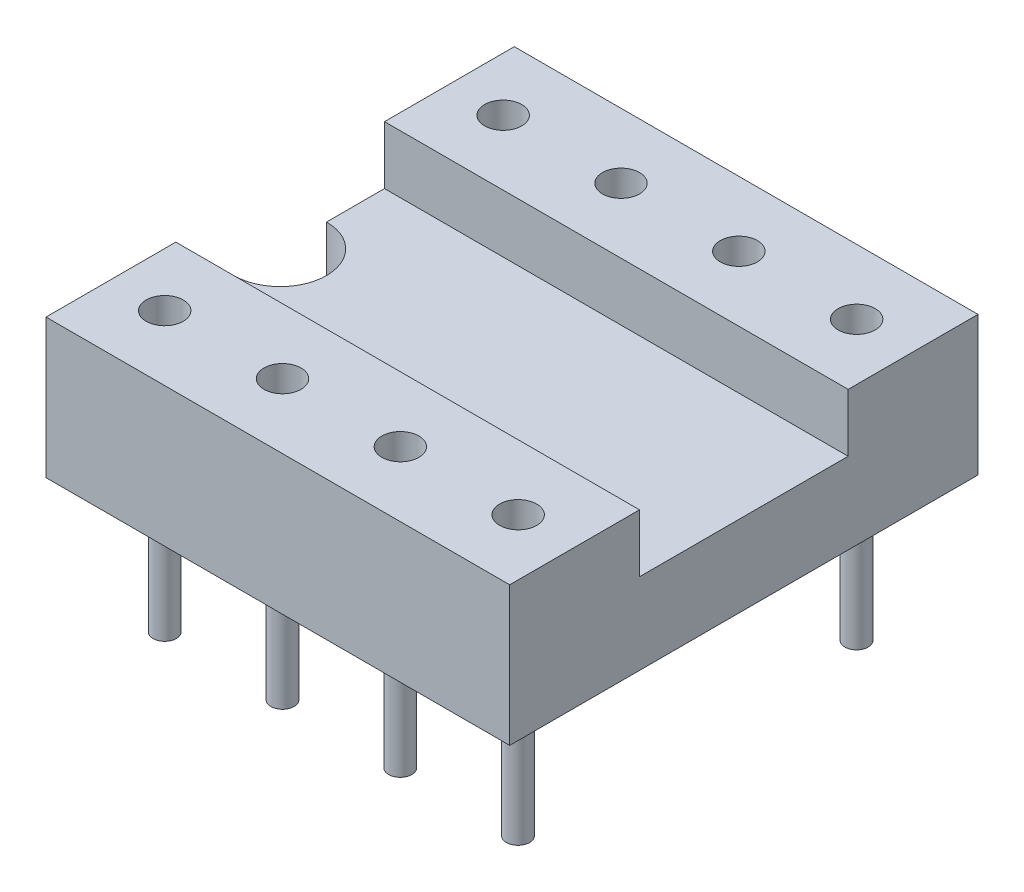
ISO-10303-21;
HEADER;
FILE_DESCRIPTION(('STEP AP214'),'2;1');
FILE_NAME('part.step','',(''),(''),'','','');
FILE_SCHEMA(('AUTOMOTIVE_DESIGN { 1 0 10303 214 1 1 1 1 }'));
ENDSEC;
DATA;
#1=APPLICATION_CONTEXT('core data for automotive mechanical design processes');
#2=APPLICATION_PROTOCOL_DEFINITION('international standard','automotive_design',2000,#1);
#3=PRODUCT_CONTEXT('',#1,'mechanical');
#4=PRODUCT('Part','Part','',(#3));
#5=PRODUCT_RELATED_PRODUCT_CATEGORY('part','',(#4));
#6=PRODUCT_DEFINITION_FORMATION('','',#4);
#7=PRODUCT_DEFINITION_CONTEXT('part definition',#1,'design');
#8=PRODUCT_DEFINITION('design','',#6,#7);
#9=PRODUCT_DEFINITION_SHAPE('','',#8);
#10=(LENGTH_UNIT() NAMED_UNIT(*) SI_UNIT(.MILLI.,.METRE.));
#11=(NAMED_UNIT(*) PLANE_ANGLE_UNIT() SI_UNIT($,.RADIAN.));
#12=(NAMED_UNIT(*) SI_UNIT($,.STERADIAN.) SOLID_ANGLE_UNIT());
#13=UNCERTAINTY_MEASURE_WITH_UNIT(LENGTH_MEASURE(1.E-05),#10,'distance_accuracy_value','');
#14=(GEOMETRIC_REPRESENTATION_CONTEXT(3) GLOBAL_UNCERTAINTY_ASSIGNED_CONTEXT((#13)) GLOBAL_UNIT_ASSIGNED_CONTEXT((#10,
#11,#12)) REPRESENTATION_CONTEXT('',''));
#15=CARTESIAN_POINT('',(0.,0.,0.));
#16=DIRECTION('',(0.,0.,1.));
#17=DIRECTION('',(1.,0.,0.));
#18=AXIS2_PLACEMENT_3D('',#15,#16,#17);
#19=CARTESIAN_POINT('',(10.,0.,5.05));
#20=DIRECTION('',(0.,1.,0.));
#21=DIRECTION('',(0.,0.,1.));
#22=AXIS2_PLACEMENT_3D('',#19,#20,#21);
#23=PLANE('',#22);
#24=CARTESIAN_POINT('',(8.78,0.,3.65));
#25=DIRECTION('',(0.,1.,0.));
#26=DIRECTION('',(0.,0.,1.));
#27=AXIS2_PLACEMENT_3D('',#24,#25,#26);
#28=CIRCLE('',#27,0.25);
#29=CARTESIAN_POINT('',(8.78,0.,3.9));
#30=VERTEX_POINT('',#29);
#31=EDGE_CURVE('E44',#30,#30,#28,.F.);
#32=ORIENTED_EDGE('',*,*,#31,.F.);
#33=EDGE_LOOP('',(#32));
#34=FACE_BOUND('',#33,.T.);
#35=CARTESIAN_POINT('',(6.24,0.,3.65));
#36=DIRECTION('',(0.,1.,0.));
#37=DIRECTION('',(0.,0.,1.));
#38=AXIS2_PLACEMENT_3D('',#35,#36,#37);
#39=CIRCLE('',#38,0.25);
#40=CARTESIAN_POINT('',(6.24,0.,3.9));
#41=VERTEX_POINT('',#40);
#42=EDGE_CURVE('E202',#41,#41,#39,.F.);
#43=ORIENTED_EDGE('',*,*,#42,.F.);
#44=EDGE_LOOP('',(#43));
#45=FACE_BOUND('',#44,.T.);
#46=CARTESIAN_POINT('',(3.7,0.,3.65));
#47=DIRECTION('',(0.,1.,0.));
#48=DIRECTION('',(0.,0.,1.));
#49=AXIS2_PLACEMENT_3D('',#46,#47,#48);
#50=CIRCLE('',#49,0.25);
#51=CARTESIAN_POINT('',(3.7,0.,3.9));
#52=VERTEX_POINT('',#51);
#53=EDGE_CURVE('E196',#52,#52,#50,.F.);
#54=ORIENTED_EDGE('',*,*,#53,.F.);
#55=EDGE_LOOP('',(#54));
#56=FACE_BOUND('',#55,.T.);
#57=CARTESIAN_POINT('',(1.16,0.,3.65));
#58=DIRECTION('',(0.,1.,0.));
#59=DIRECTION('',(0.,0.,1.));
#60=AXIS2_PLACEMENT_3D('',#57,#58,#59);
#61=CIRCLE('',#60,0.25);
#62=CARTESIAN_POINT('',(1.16,0.,3.9));
#63=VERTEX_POINT('',#62);
#64=EDGE_CURVE('E190',#63,#63,#61,.F.);
#65=ORIENTED_EDGE('',*,*,#64,.F.);
#66=EDGE_LOOP('',(#65));
#67=FACE_BOUND('',#66,.T.);
#68=DIRECTION('',(0.,0.,-1.));
#69=VECTOR('',#68,1.);
#70=CARTESIAN_POINT('',(0.,0.,5.05));
#71=LINE('',#70,#69);
#72=CARTESIAN_POINT('',(0.,0.,5.05));
#73=VERTEX_POINT('',#72);
#74=CARTESIAN_POINT('',(0.,0.,1.));
#75=VERTEX_POINT('',#74);
#76=EDGE_CURVE('E144',#73,#75,#71,.T.);
#77=ORIENTED_EDGE('',*,*,#76,.T.);
#78=CARTESIAN_POINT('',(0.,0.,0.));
#79=DIRECTION('',(0.,1.,0.));
#80=DIRECTION('',(0.,0.,1.));
#81=AXIS2_PLACEMENT_3D('',#78,#79,#80);
#82=CIRCLE('',#81,1.);
#83=CARTESIAN_POINT('',(0.,0.,-1.));
#84=VERTEX_POINT('',#83);
#85=EDGE_CURVE('E51',#75,#84,#82,.T.);
#86=ORIENTED_EDGE('',*,*,#85,.T.);
#87=CARTESIAN_POINT('',(0.,0.,-5.05));
#88=VERTEX_POINT('',#87);
#89=EDGE_CURVE('E129',#84,#88,#71,.T.);
#90=ORIENTED_EDGE('',*,*,#89,.T.);
#91=DIRECTION('',(-1.,0.,0.));
#92=VECTOR('',#91,1.);
#93=CARTESIAN_POINT('',(10.,0.,-5.05));
#94=LINE('',#93,#92);
#95=CARTESIAN_POINT('',(10.,0.,-5.05));
#96=VERTEX_POINT('',#95);
#97=EDGE_CURVE('E175',#96,#88,#94,.T.);
#98=ORIENTED_EDGE('',*,*,#97,.F.);
#99=DIRECTION('',(0.,0.,-1.));
#100=VECTOR('',#99,1.);
#101=CARTESIAN_POINT('',(10.,0.,5.05));
#102=LINE('',#101,#100);
#103=CARTESIAN_POINT('',(10.,0.,5.05));
#104=VERTEX_POINT('',#103);
#105=EDGE_CURVE('E161',#104,#96,#102,.T.);
#106=ORIENTED_EDGE('',*,*,#105,.F.);
#107=DIRECTION('',(-1.,0.,0.));
#108=VECTOR('',#107,1.);
#109=CARTESIAN_POINT('',(10.,0.,5.05));
#110=LINE('',#109,#108);
#111=EDGE_CURVE('E178',#104,#73,#110,.T.);
#112=ORIENTED_EDGE('',*,*,#111,.T.);
#113=EDGE_LOOP('',(#77,#86,#90,#98,#106,#112));
#114=FACE_BOUND('',#113,.T.);
#115=CARTESIAN_POINT('',(1.16,0.,-3.65));
#116=DIRECTION('',(0.,1.,0.));
#117=DIRECTION('',(0.,0.,1.));
#118=AXIS2_PLACEMENT_3D('',#115,#116,#117);
#119=CIRCLE('',#118,0.25);
#120=CARTESIAN_POINT('',(1.16,0.,-3.4));
#121=VERTEX_POINT('',#120);
#122=EDGE_CURVE('E193',#121,#121,#119,.F.);
#123=ORIENTED_EDGE('',*,*,#122,.F.);
#124=EDGE_LOOP('',(#123));
#125=FACE_BOUND('',#124,.T.);
#126=CARTESIAN_POINT('',(3.7,0.,-3.65));
#127=DIRECTION('',(0.,1.,0.));
#128=DIRECTION('',(0.,0.,1.));
#129=AXIS2_PLACEMENT_3D('',#126,#127,#128);
#130=CIRCLE('',#129,0.25);
#131=CARTESIAN_POINT('',(3.7,0.,-3.4));
#132=VERTEX_POINT('',#131);
#133=EDGE_CURVE('E199',#132,#132,#130,.F.);
#134=ORIENTED_EDGE('',*,*,#133,.F.);
#135=EDGE_LOOP('',(#134));
#136=FACE_BOUND('',#135,.T.);
#137=CARTESIAN_POINT('',(6.24,0.,-3.65));
#138=DIRECTION('',(0.,1.,0.));
#139=DIRECTION('',(0.,0.,1.));
#140=AXIS2_PLACEMENT_3D('',#137,#138,#139);
#141=CIRCLE('',#140,0.25);
#142=CARTESIAN_POINT('',(6.24,0.,-3.4));
#143=VERTEX_POINT('',#142);
#144=EDGE_CURVE('E205',#143,#143,#141,.F.);
#145=ORIENTED_EDGE('',*,*,#144,.F.);
#146=EDGE_LOOP('',(#145));
#147=FACE_BOUND('',#146,.T.);
#148=CARTESIAN_POINT('',(8.78,0.,-3.65));
#149=DIRECTION('',(0.,1.,0.));
#150=DIRECTION('',(0.,0.,1.));
#151=AXIS2_PLACEMENT_3D('',#148,#149,#150);
#152=CIRCLE('',#151,0.25);
#153=CARTESIAN_POINT('',(8.78,0.,-3.4));
#154=VERTEX_POINT('',#153);
#155=EDGE_CURVE('E11',#154,#154,#152,.F.);
#156=ORIENTED_EDGE('',*,*,#155,.F.);
#157=EDGE_LOOP('',(#156));
#158=FACE_BOUND('',#157,.T.);
#159=ADVANCED_FACE('F36',(#34,#45,#56,#67,#114,#125,#136,#147,#158),#23,.F.);
#160=CARTESIAN_POINT('',(0.,1.75,5.05));
#161=DIRECTION('',(1.,0.,0.));
#162=DIRECTION('',(0.,0.,-1.));
#163=AXIS2_PLACEMENT_3D('',#160,#161,#162);
#164=PLANE('',#163);
#165=ORIENTED_EDGE('',*,*,#89,.F.);
#166=DIRECTION('',(0.,1.,0.));
#167=VECTOR('',#166,1.);
#168=CARTESIAN_POINT('',(0.,0.,-1.));
#169=LINE('',#168,#167);
#170=CARTESIAN_POINT('',(0.,1.75,-1.));
#171=VERTEX_POINT('',#170);
#172=EDGE_CURVE('E115',#84,#171,#169,.T.);
#173=ORIENTED_EDGE('',*,*,#172,.T.);
#174=DIRECTION('',(0.,0.,1.));
#175=VECTOR('',#174,1.);
#176=CARTESIAN_POINT('',(0.,1.75,-2.25));
#177=LINE('',#176,#175);
#178=CARTESIAN_POINT('',(0.,1.75,-2.25));
#179=VERTEX_POINT('',#178);
#180=EDGE_CURVE('E127',#179,#171,#177,.T.);
#181=ORIENTED_EDGE('',*,*,#180,.F.);
#182=DIRECTION('',(0.,-1.,0.));
#183=VECTOR('',#182,1.);
#184=CARTESIAN_POINT('',(0.,3.,-2.25));
#185=LINE('',#184,#183);
#186=CARTESIAN_POINT('',(0.,3.,-2.25));
#187=VERTEX_POINT('',#186);
#188=EDGE_CURVE('E151',#187,#179,#185,.T.);
#189=ORIENTED_EDGE('',*,*,#188,.F.);
#190=DIRECTION('',(0.,0.,1.));
#191=VECTOR('',#190,1.);
#192=CARTESIAN_POINT('',(0.,3.,-5.05));
#193=LINE('',#192,#191);
#194=CARTESIAN_POINT('',(0.,3.,-5.05));
#195=VERTEX_POINT('',#194);
#196=EDGE_CURVE('E149',#195,#187,#193,.T.);
#197=ORIENTED_EDGE('',*,*,#196,.F.);
#198=DIRECTION('',(0.,1.,0.));
#199=VECTOR('',#198,1.);
#200=CARTESIAN_POINT('',(0.,0.,-5.05));
#201=LINE('',#200,#199);
#202=EDGE_CURVE('E147',#88,#195,#201,.T.);
#203=ORIENTED_EDGE('',*,*,#202,.F.);
#204=EDGE_LOOP('',(#165,#173,#181,#189,#197,#203));
#205=FACE_BOUND('',#204,.T.);
#206=ADVANCED_FACE('F125',(#205),#164,.F.);
#207=CARTESIAN_POINT('',(10.,1.75,-2.25));
#208=DIRECTION('',(0.,-1.,0.));
#209=DIRECTION('',(0.,0.,-1.));
#210=AXIS2_PLACEMENT_3D('',#207,#208,#209);
#211=PLANE('',#210);
#212=ORIENTED_EDGE('',*,*,#180,.T.);
#213=CARTESIAN_POINT('',(0.,1.75,0.));
#214=DIRECTION('',(0.,1.,0.));
#215=DIRECTION('',(0.,0.,1.));
#216=AXIS2_PLACEMENT_3D('',#213,#214,#215);
#217=CIRCLE('',#216,1.);
#218=CARTESIAN_POINT('',(0.,1.75,1.));
#219=VERTEX_POINT('',#218);
#220=EDGE_CURVE('E112',#219,#171,#217,.T.);
#221=ORIENTED_EDGE('',*,*,#220,.F.);
#222=CARTESIAN_POINT('',(0.,1.75,2.25));
#223=VERTEX_POINT('',#222);
#224=EDGE_CURVE('E135',#219,#223,#177,.T.);
#225=ORIENTED_EDGE('',*,*,#224,.T.);
#226=DIRECTION('',(-1.,0.,0.));
#227=VECTOR('',#226,1.);
#228=CARTESIAN_POINT('',(10.,1.75,2.25));
#229=LINE('',#228,#227);
#230=CARTESIAN_POINT('',(10.,1.75,2.25));
#231=VERTEX_POINT('',#230);
#232=EDGE_CURVE('E187',#231,#223,#229,.T.);
#233=ORIENTED_EDGE('',*,*,#232,.F.);
#234=DIRECTION('',(0.,0.,1.));
#235=VECTOR('',#234,1.);
#236=CARTESIAN_POINT('',(10.,1.75,-2.25));
#237=LINE('',#236,#235);
#238=CARTESIAN_POINT('',(10.,1.75,-2.25));
#239=VERTEX_POINT('',#238);
#240=EDGE_CURVE('E153',#239,#231,#237,.T.);
#241=ORIENTED_EDGE('',*,*,#240,.F.);
#242=DIRECTION('',(-1.,0.,0.));
#243=VECTOR('',#242,1.);
#244=CARTESIAN_POINT('',(10.,1.75,-2.25));
#245=LINE('',#244,#243);
#246=EDGE_CURVE('E133',#239,#179,#245,.T.);
#247=ORIENTED_EDGE('',*,*,#246,.T.);
#248=EDGE_LOOP('',(#212,#221,#225,#233,#241,#247));
#249=FACE_BOUND('',#248,.T.);
#250=ADVANCED_FACE('F38',(#249),#211,.F.);
#251=CARTESIAN_POINT('',(10.,1.75,2.25));
#252=DIRECTION('',(0.,0.,1.));
#253=DIRECTION('',(0.,-1.,0.));
#254=AXIS2_PLACEMENT_3D('',#251,#252,#253);
#255=PLANE('',#254);
#256=DIRECTION('',(0.,1.,0.));
#257=VECTOR('',#256,1.);
#258=CARTESIAN_POINT('',(0.,1.75,2.25));
#259=LINE('',#258,#257);
#260=CARTESIAN_POINT('',(0.,3.,2.25));
#261=VERTEX_POINT('',#260);
#262=EDGE_CURVE('E134',#223,#261,#259,.T.);
#263=ORIENTED_EDGE('',*,*,#262,.T.);
#264=DIRECTION('',(-1.,0.,0.));
#265=VECTOR('',#264,1.);
#266=CARTESIAN_POINT('',(10.,3.,2.25));
#267=LINE('',#266,#265);
#268=CARTESIAN_POINT('',(10.,3.,2.25));
#269=VERTEX_POINT('',#268);
#270=EDGE_CURVE('E184',#269,#261,#267,.T.);
#271=ORIENTED_EDGE('',*,*,#270,.F.);
#272=DIRECTION('',(0.,1.,0.));
#273=VECTOR('',#272,1.);
#274=CARTESIAN_POINT('',(10.,1.75,2.25));
#275=LINE('',#274,#273);
#276=EDGE_CURVE('E155',#231,#269,#275,.T.);
#277=ORIENTED_EDGE('',*,*,#276,.F.);
#278=ORIENTED_EDGE('',*,*,#232,.T.);
#279=EDGE_LOOP('',(#263,#271,#277,#278));
#280=FACE_BOUND('',#279,.T.);
#281=ADVANCED_FACE('F389',(#280),#255,.F.);
#282=CARTESIAN_POINT('',(10.,3.,2.25));
#283=DIRECTION('',(0.,-1.,0.));
#284=DIRECTION('',(0.,0.,-1.));
#285=AXIS2_PLACEMENT_3D('',#282,#283,#284);
#286=PLANE('',#285);
#287=CARTESIAN_POINT('',(8.783,3.,3.64999999999995));
#288=DIRECTION('',(0.,1.,0.));
#289=DIRECTION('',(0.,0.,1.));
#290=AXIS2_PLACEMENT_3D('',#287,#288,#289);
#291=CIRCLE('',#290,0.399999999999999);
#292=CARTESIAN_POINT('',(8.783,3.,4.04999999999995));
#293=VERTEX_POINT('',#292);
#294=EDGE_CURVE('E450',#293,#293,#291,.T.);
#295=ORIENTED_EDGE('',*,*,#294,.F.);
#296=EDGE_LOOP('',(#295));
#297=FACE_BOUND('',#296,.T.);
#298=CARTESIAN_POINT('',(6.242,3.,3.64999999999996));
#299=DIRECTION('',(0.,1.,0.));
#300=DIRECTION('',(0.,0.,1.));
#301=AXIS2_PLACEMENT_3D('',#298,#299,#300);
#302=CIRCLE('',#301,0.4);
#303=CARTESIAN_POINT('',(6.242,3.,4.04999999999996));
#304=VERTEX_POINT('',#303);
#305=EDGE_CURVE('E438',#304,#304,#302,.T.);
#306=ORIENTED_EDGE('',*,*,#305,.F.);
#307=EDGE_LOOP('',(#306));
#308=FACE_BOUND('',#307,.T.);
#309=CARTESIAN_POINT('',(3.701,3.,3.64999999999998));
#310=DIRECTION('',(0.,1.,0.));
#311=DIRECTION('',(0.,0.,1.));
#312=AXIS2_PLACEMENT_3D('',#309,#310,#311);
#313=CIRCLE('',#312,0.4);
#314=CARTESIAN_POINT('',(3.701,3.,4.04999999999998));
#315=VERTEX_POINT('',#314);
#316=EDGE_CURVE('E426',#315,#315,#313,.T.);
#317=ORIENTED_EDGE('',*,*,#316,.F.);
#318=EDGE_LOOP('',(#317));
#319=FACE_BOUND('',#318,.T.);
#320=CARTESIAN_POINT('',(1.16,3.,3.65));
#321=DIRECTION('',(0.,1.,0.));
#322=DIRECTION('',(0.,0.,1.));
#323=AXIS2_PLACEMENT_3D('',#320,#321,#322);
#324=CIRCLE('',#323,0.4);
#325=CARTESIAN_POINT('',(1.16,3.,4.05));
#326=VERTEX_POINT('',#325);
#327=EDGE_CURVE('E414',#326,#326,#324,.T.);
#328=ORIENTED_EDGE('',*,*,#327,.F.);
#329=EDGE_LOOP('',(#328));
#330=FACE_BOUND('',#329,.T.);
#331=DIRECTION('',(0.,0.,1.));
#332=VECTOR('',#331,1.);
#333=CARTESIAN_POINT('',(0.,3.,2.25));
#334=LINE('',#333,#332);
#335=CARTESIAN_POINT('',(0.,3.,5.05));
#336=VERTEX_POINT('',#335);
#337=EDGE_CURVE('E137',#261,#336,#334,.T.);
#338=ORIENTED_EDGE('',*,*,#337,.T.);
#339=DIRECTION('',(-1.,0.,0.));
#340=VECTOR('',#339,1.);
#341=CARTESIAN_POINT('',(10.,3.,5.05));
#342=LINE('',#341,#340);
#343=CARTESIAN_POINT('',(10.,3.,5.05));
#344=VERTEX_POINT('',#343);
#345=EDGE_CURVE('E181',#344,#336,#342,.T.);
#346=ORIENTED_EDGE('',*,*,#345,.F.);
#347=DIRECTION('',(0.,0.,1.));
#348=VECTOR('',#347,1.);
#349=CARTESIAN_POINT('',(10.,3.,2.25));
#350=LINE('',#349,#348);
#351=EDGE_CURVE('E157',#269,#344,#350,.T.);
#352=ORIENTED_EDGE('',*,*,#351,.F.);
#353=ORIENTED_EDGE('',*,*,#270,.T.);
#354=EDGE_LOOP('',(#338,#346,#352,#353));
#355=FACE_BOUND('',#354,.T.);
#356=ADVANCED_FACE('F386',(#297,#308,#319,#330,#355),#286,.F.);
#357=CARTESIAN_POINT('',(10.,3.,5.05));
#358=DIRECTION('',(0.,0.,-1.));
#359=DIRECTION('',(-1.,0.,0.));
#360=AXIS2_PLACEMENT_3D('',#357,#358,#359);
#361=PLANE('',#360);
#362=DIRECTION('',(0.,-1.,0.));
#363=VECTOR('',#362,1.);
#364=CARTESIAN_POINT('',(0.,3.,5.05));
#365=LINE('',#364,#363);
#366=EDGE_CURVE('E142',#336,#73,#365,.T.);
#367=ORIENTED_EDGE('',*,*,#366,.T.);
#368=ORIENTED_EDGE('',*,*,#111,.F.);
#369=DIRECTION('',(0.,-1.,0.));
#370=VECTOR('',#369,1.);
#371=CARTESIAN_POINT('',(10.,3.,5.05));
#372=LINE('',#371,#370);
#373=EDGE_CURVE('E159',#344,#104,#372,.T.);
#374=ORIENTED_EDGE('',*,*,#373,.F.);
#375=ORIENTED_EDGE('',*,*,#345,.T.);
#376=EDGE_LOOP('',(#367,#368,#374,#375));
#377=FACE_BOUND('',#376,.T.);
#378=ADVANCED_FACE('F381',(#377),#361,.F.);
#379=CARTESIAN_POINT('',(10.,0.,-5.05));
#380=DIRECTION('',(0.,0.,1.));
#381=DIRECTION('',(0.,-1.,0.));
#382=AXIS2_PLACEMENT_3D('',#379,#380,#381);
#383=PLANE('',#382);
#384=ORIENTED_EDGE('',*,*,#202,.T.);
#385=DIRECTION('',(-1.,0.,0.));
#386=VECTOR('',#385,1.);
#387=CARTESIAN_POINT('',(10.,3.,-5.05));
#388=LINE('',#387,#386);
#389=CARTESIAN_POINT('',(10.,3.,-5.05));
#390=VERTEX_POINT('',#389);
#391=EDGE_CURVE('E172',#390,#195,#388,.T.);
#392=ORIENTED_EDGE('',*,*,#391,.F.);
#393=DIRECTION('',(0.,1.,0.));
#394=VECTOR('',#393,1.);
#395=CARTESIAN_POINT('',(10.,0.,-5.05));
#396=LINE('',#395,#394);
#397=EDGE_CURVE('E163',#96,#390,#396,.T.);
#398=ORIENTED_EDGE('',*,*,#397,.F.);
#399=ORIENTED_EDGE('',*,*,#97,.T.);
#400=EDGE_LOOP('',(#384,#392,#398,#399));
#401=FACE_BOUND('',#400,.T.);
#402=ADVANCED_FACE('F378',(#401),#383,.F.);
#403=CARTESIAN_POINT('',(10.,3.,-5.05));
#404=DIRECTION('',(0.,-1.,0.));
#405=DIRECTION('',(0.,0.,-1.));
#406=AXIS2_PLACEMENT_3D('',#403,#404,#405);
#407=PLANE('',#406);
#408=CARTESIAN_POINT('',(8.783,3.,-3.65000000000005));
#409=DIRECTION('',(0.,1.,0.));
#410=DIRECTION('',(0.,0.,-1.));
#411=AXIS2_PLACEMENT_3D('',#408,#409,#410);
#412=CIRCLE('',#411,0.399999999999999);
#413=CARTESIAN_POINT('',(8.783,3.,-4.05000000000005));
#414=VERTEX_POINT('',#413);
#415=EDGE_CURVE('E456',#414,#414,#412,.T.);
#416=ORIENTED_EDGE('',*,*,#415,.F.);
#417=EDGE_LOOP('',(#416));
#418=FACE_BOUND('',#417,.T.);
#419=CARTESIAN_POINT('',(6.242,3.,-3.65000000000003));
#420=DIRECTION('',(0.,1.,0.));
#421=DIRECTION('',(0.,0.,-1.));
#422=AXIS2_PLACEMENT_3D('',#419,#420,#421);
#423=CIRCLE('',#422,0.4);
#424=CARTESIAN_POINT('',(6.242,3.,-4.05000000000004));
#425=VERTEX_POINT('',#424);
#426=EDGE_CURVE('E444',#425,#425,#423,.T.);
#427=ORIENTED_EDGE('',*,*,#426,.F.);
#428=EDGE_LOOP('',(#427));
#429=FACE_BOUND('',#428,.T.);
#430=CARTESIAN_POINT('',(3.701,3.,-3.65000000000002));
#431=DIRECTION('',(0.,1.,0.));
#432=DIRECTION('',(0.,0.,-1.));
#433=AXIS2_PLACEMENT_3D('',#430,#431,#432);
#434=CIRCLE('',#433,0.4);
#435=CARTESIAN_POINT('',(3.701,3.,-4.05000000000002));
#436=VERTEX_POINT('',#435);
#437=EDGE_CURVE('E432',#436,#436,#434,.T.);
#438=ORIENTED_EDGE('',*,*,#437,.F.);
#439=EDGE_LOOP('',(#438));
#440=FACE_BOUND('',#439,.T.);
#441=CARTESIAN_POINT('',(1.16,3.,-3.65));
#442=DIRECTION('',(0.,1.,0.));
#443=DIRECTION('',(0.,0.,-1.));
#444=AXIS2_PLACEMENT_3D('',#441,#442,#443);
#445=CIRCLE('',#444,0.4);
#446=CARTESIAN_POINT('',(1.16,3.,-4.05));
#447=VERTEX_POINT('',#446);
#448=EDGE_CURVE('E420',#447,#447,#445,.T.);
#449=ORIENTED_EDGE('',*,*,#448,.F.);
#450=EDGE_LOOP('',(#449));
#451=FACE_BOUND('',#450,.T.);
#452=ORIENTED_EDGE('',*,*,#196,.T.);
#453=DIRECTION('',(-1.,0.,0.));
#454=VECTOR('',#453,1.);
#455=CARTESIAN_POINT('',(10.,3.,-2.25));
#456=LINE('',#455,#454);
#457=CARTESIAN_POINT('',(10.,3.,-2.25));
#458=VERTEX_POINT('',#457);
#459=EDGE_CURVE('E169',#458,#187,#456,.T.);
#460=ORIENTED_EDGE('',*,*,#459,.F.);
#461=DIRECTION('',(0.,0.,1.));
#462=VECTOR('',#461,1.);
#463=CARTESIAN_POINT('',(10.,3.,-5.05));
#464=LINE('',#463,#462);
#465=EDGE_CURVE('E165',#390,#458,#464,.T.);
#466=ORIENTED_EDGE('',*,*,#465,.F.);
#467=ORIENTED_EDGE('',*,*,#391,.T.);
#468=EDGE_LOOP('',(#452,#460,#466,#467));
#469=FACE_BOUND('',#468,.T.);
#470=ADVANCED_FACE('F374',(#418,#429,#440,#451,#469),#407,.F.);
#471=CARTESIAN_POINT('',(10.,3.,-2.25));
#472=DIRECTION('',(0.,0.,-1.));
#473=DIRECTION('',(0.,1.,0.));
#474=AXIS2_PLACEMENT_3D('',#471,#472,#473);
#475=PLANE('',#474);
#476=ORIENTED_EDGE('',*,*,#188,.T.);
#477=ORIENTED_EDGE('',*,*,#246,.F.);
#478=DIRECTION('',(0.,-1.,0.));
#479=VECTOR('',#478,1.);
#480=CARTESIAN_POINT('',(10.,3.,-2.25));
#481=LINE('',#480,#479);
#482=EDGE_CURVE('E59',#458,#239,#481,.T.);
#483=ORIENTED_EDGE('',*,*,#482,.F.);
#484=ORIENTED_EDGE('',*,*,#459,.T.);
#485=EDGE_LOOP('',(#476,#477,#483,#484));
#486=FACE_BOUND('',#485,.T.);
#487=ADVANCED_FACE('F371',(#486),#475,.F.);
#488=CARTESIAN_POINT('',(10.,1.75,5.05));
#489=DIRECTION('',(1.,0.,0.));
#490=DIRECTION('',(0.,0.,-1.));
#491=AXIS2_PLACEMENT_3D('',#488,#489,#490);
#492=PLANE('',#491);
#493=ORIENTED_EDGE('',*,*,#240,.T.);
#494=ORIENTED_EDGE('',*,*,#276,.T.);
#495=ORIENTED_EDGE('',*,*,#351,.T.);
#496=ORIENTED_EDGE('',*,*,#373,.T.);
#497=ORIENTED_EDGE('',*,*,#105,.T.);
#498=ORIENTED_EDGE('',*,*,#397,.T.);
#499=ORIENTED_EDGE('',*,*,#465,.T.);
#500=ORIENTED_EDGE('',*,*,#482,.T.);
#501=EDGE_LOOP('',(#493,#494,#495,#496,#497,#498,#499,#500));
#502=FACE_BOUND('',#501,.T.);
#503=ADVANCED_FACE('F367',(#502),#492,.T.);
#504=ORIENTED_EDGE('',*,*,#224,.F.);
#505=DIRECTION('',(0.,1.,0.));
#506=VECTOR('',#505,1.);
#507=CARTESIAN_POINT('',(0.,0.,1.));
#508=LINE('',#507,#506);
#509=EDGE_CURVE('E116',#75,#219,#508,.T.);
#510=ORIENTED_EDGE('',*,*,#509,.F.);
#511=ORIENTED_EDGE('',*,*,#76,.F.);
#512=ORIENTED_EDGE('',*,*,#366,.F.);
#513=ORIENTED_EDGE('',*,*,#337,.F.);
#514=ORIENTED_EDGE('',*,*,#262,.F.);
#515=EDGE_LOOP('',(#504,#510,#511,#512,#513,#514));
#516=FACE_BOUND('',#515,.T.);
#517=ADVANCED_FACE('F364',(#516),#164,.F.);
#518=CARTESIAN_POINT('',(0.,0.,0.));
#519=DIRECTION('',(0.,1.,0.));
#520=DIRECTION('',(0.,0.,1.));
#521=AXIS2_PLACEMENT_3D('',#518,#519,#520);
#522=CYLINDRICAL_SURFACE('',#521,1.);
#523=ORIENTED_EDGE('',*,*,#220,.T.);
#524=ORIENTED_EDGE('',*,*,#172,.F.);
#525=ORIENTED_EDGE('',*,*,#85,.F.);
#526=ORIENTED_EDGE('',*,*,#509,.T.);
#527=EDGE_LOOP('',(#523,#524,#525,#526));
#528=FACE_BOUND('',#527,.T.);
#529=ADVANCED_FACE('F114',(#528),#522,.F.);
#530=CARTESIAN_POINT('',(1.16,0.5,3.65));
#531=DIRECTION('',(0.,1.,0.));
#532=DIRECTION('',(0.,0.,1.));
#533=AXIS2_PLACEMENT_3D('',#530,#531,#532);
#534=CYLINDRICAL_SURFACE('',#533,0.4);
#535=CARTESIAN_POINT('',(1.16,0.5,3.65));
#536=DIRECTION('',(0.,1.,0.));
#537=DIRECTION('',(0.,0.,1.));
#538=AXIS2_PLACEMENT_3D('',#535,#536,#537);
#539=CIRCLE('',#538,0.4);
#540=CARTESIAN_POINT('',(1.16,0.5,4.05));
#541=VERTEX_POINT('',#540);
#542=EDGE_CURVE('E120',#541,#541,#539,.T.);
#543=ORIENTED_EDGE('',*,*,#542,.F.);
#544=EDGE_LOOP('',(#543));
#545=FACE_BOUND('',#544,.T.);
#546=ORIENTED_EDGE('',*,*,#327,.T.);
#547=EDGE_LOOP('',(#546));
#548=FACE_BOUND('',#547,.T.);
#549=ADVANCED_FACE('F357',(#545,#548),#534,.F.);
#550=CARTESIAN_POINT('',(1.16,0.5,3.65));
#551=DIRECTION('',(0.,1.,0.));
#552=DIRECTION('',(0.,0.,1.));
#553=AXIS2_PLACEMENT_3D('',#550,#551,#552);
#554=PLANE('',#553);
#555=ORIENTED_EDGE('',*,*,#542,.T.);
#556=EDGE_LOOP('',(#555));
#557=FACE_BOUND('',#556,.T.);
#558=ADVANCED_FACE('F353',(#557),#554,.T.);
#559=CARTESIAN_POINT('',(1.16,0.5,-3.65));
#560=DIRECTION('',(0.,1.,0.));
#561=DIRECTION('',(0.,0.,1.));
#562=AXIS2_PLACEMENT_3D('',#559,#560,#561);
#563=CYLINDRICAL_SURFACE('',#562,0.4);
#564=CARTESIAN_POINT('',(1.16,0.5,-3.65));
#565=DIRECTION('',(0.,1.,0.));
#566=DIRECTION('',(0.,0.,-1.));
#567=AXIS2_PLACEMENT_3D('',#564,#565,#566);
#568=CIRCLE('',#567,0.4);
#569=CARTESIAN_POINT('',(1.16,0.5,-4.05));
#570=VERTEX_POINT('',#569);
#571=EDGE_CURVE('E417',#570,#570,#568,.T.);
#572=ORIENTED_EDGE('',*,*,#571,.F.);
#573=EDGE_LOOP('',(#572));
#574=FACE_BOUND('',#573,.T.);
#575=ORIENTED_EDGE('',*,*,#448,.T.);
#576=EDGE_LOOP('',(#575));
#577=FACE_BOUND('',#576,.T.);
#578=ADVANCED_FACE('F349',(#574,#577),#563,.F.);
#579=CARTESIAN_POINT('',(1.16,0.5,-3.65));
#580=DIRECTION('',(0.,-1.,0.));
#581=DIRECTION('',(0.,0.,-1.));
#582=AXIS2_PLACEMENT_3D('',#579,#580,#581);
#583=PLANE('',#582);
#584=ORIENTED_EDGE('',*,*,#571,.T.);
#585=EDGE_LOOP('',(#584));
#586=FACE_BOUND('',#585,.T.);
#587=ADVANCED_FACE('F345',(#586),#583,.F.);
#588=CARTESIAN_POINT('',(3.701,0.5,3.64999999999998));
#589=DIRECTION('',(0.,1.,0.));
#590=DIRECTION('',(0.,0.,1.));
#591=AXIS2_PLACEMENT_3D('',#588,#589,#590);
#592=CYLINDRICAL_SURFACE('',#591,0.4);
#593=CARTESIAN_POINT('',(3.701,0.5,3.64999999999998));
#594=DIRECTION('',(0.,1.,0.));
#595=DIRECTION('',(0.,0.,1.));
#596=AXIS2_PLACEMENT_3D('',#593,#594,#595);
#597=CIRCLE('',#596,0.4);
#598=CARTESIAN_POINT('',(3.701,0.5,4.04999999999998));
#599=VERTEX_POINT('',#598);
#600=EDGE_CURVE('E423',#599,#599,#597,.T.);
#601=ORIENTED_EDGE('',*,*,#600,.F.);
#602=EDGE_LOOP('',(#601));
#603=FACE_BOUND('',#602,.T.);
#604=ORIENTED_EDGE('',*,*,#316,.T.);
#605=EDGE_LOOP('',(#604));
#606=FACE_BOUND('',#605,.T.);
#607=ADVANCED_FACE('F341',(#603,#606),#592,.F.);
#608=CARTESIAN_POINT('',(3.701,0.5,3.64999999999998));
#609=DIRECTION('',(0.,1.,0.));
#610=DIRECTION('',(0.,0.,1.));
#611=AXIS2_PLACEMENT_3D('',#608,#609,#610);
#612=PLANE('',#611);
#613=ORIENTED_EDGE('',*,*,#600,.T.);
#614=EDGE_LOOP('',(#613));
#615=FACE_BOUND('',#614,.T.);
#616=ADVANCED_FACE('F337',(#615),#612,.T.);
#617=CARTESIAN_POINT('',(3.701,0.5,-3.65000000000002));
#618=DIRECTION('',(0.,1.,0.));
#619=DIRECTION('',(0.,0.,1.));
#620=AXIS2_PLACEMENT_3D('',#617,#618,#619);
#621=CYLINDRICAL_SURFACE('',#620,0.4);
#622=CARTESIAN_POINT('',(3.701,0.5,-3.65000000000002));
#623=DIRECTION('',(0.,1.,0.));
#624=DIRECTION('',(0.,0.,-1.));
#625=AXIS2_PLACEMENT_3D('',#622,#623,#624);
#626=CIRCLE('',#625,0.4);
#627=CARTESIAN_POINT('',(3.701,0.5,-4.05000000000002));
#628=VERTEX_POINT('',#627);
#629=EDGE_CURVE('E429',#628,#628,#626,.T.);
#630=ORIENTED_EDGE('',*,*,#629,.F.);
#631=EDGE_LOOP('',(#630));
#632=FACE_BOUND('',#631,.T.);
#633=ORIENTED_EDGE('',*,*,#437,.T.);
#634=EDGE_LOOP('',(#633));
#635=FACE_BOUND('',#634,.T.);
#636=ADVANCED_FACE('F333',(#632,#635),#621,.F.);
#637=CARTESIAN_POINT('',(3.701,0.5,-3.65000000000002));
#638=DIRECTION('',(0.,-1.,0.));
#639=DIRECTION('',(0.,0.,-1.));
#640=AXIS2_PLACEMENT_3D('',#637,#638,#639);
#641=PLANE('',#640);
#642=ORIENTED_EDGE('',*,*,#629,.T.);
#643=EDGE_LOOP('',(#642));
#644=FACE_BOUND('',#643,.T.);
#645=ADVANCED_FACE('F329',(#644),#641,.F.);
#646=CARTESIAN_POINT('',(6.242,0.5,3.64999999999996));
#647=DIRECTION('',(0.,1.,0.));
#648=DIRECTION('',(0.,0.,1.));
#649=AXIS2_PLACEMENT_3D('',#646,#647,#648);
#650=CYLINDRICAL_SURFACE('',#649,0.4);
#651=CARTESIAN_POINT('',(6.242,0.5,3.64999999999996));
#652=DIRECTION('',(0.,1.,0.));
#653=DIRECTION('',(0.,0.,1.));
#654=AXIS2_PLACEMENT_3D('',#651,#652,#653);
#655=CIRCLE('',#654,0.4);
#656=CARTESIAN_POINT('',(6.242,0.5,4.04999999999996));
#657=VERTEX_POINT('',#656);
#658=EDGE_CURVE('E435',#657,#657,#655,.T.);
#659=ORIENTED_EDGE('',*,*,#658,.F.);
#660=EDGE_LOOP('',(#659));
#661=FACE_BOUND('',#660,.T.);
#662=ORIENTED_EDGE('',*,*,#305,.T.);
#663=EDGE_LOOP('',(#662));
#664=FACE_BOUND('',#663,.T.);
#665=ADVANCED_FACE('F325',(#661,#664),#650,.F.);
#666=CARTESIAN_POINT('',(6.242,0.5,3.64999999999996));
#667=DIRECTION('',(0.,1.,0.));
#668=DIRECTION('',(0.,0.,1.));
#669=AXIS2_PLACEMENT_3D('',#666,#667,#668);
#670=PLANE('',#669);
#671=ORIENTED_EDGE('',*,*,#658,.T.);
#672=EDGE_LOOP('',(#671));
#673=FACE_BOUND('',#672,.T.);
#674=ADVANCED_FACE('F321',(#673),#670,.T.);
#675=CARTESIAN_POINT('',(6.242,0.5,-3.65000000000003));
#676=DIRECTION('',(0.,1.,0.));
#677=DIRECTION('',(0.,0.,1.));
#678=AXIS2_PLACEMENT_3D('',#675,#676,#677);
#679=CYLINDRICAL_SURFACE('',#678,0.4);
#680=CARTESIAN_POINT('',(6.242,0.5,-3.65000000000003));
#681=DIRECTION('',(0.,1.,0.));
#682=DIRECTION('',(0.,0.,-1.));
#683=AXIS2_PLACEMENT_3D('',#680,#681,#682);
#684=CIRCLE('',#683,0.4);
#685=CARTESIAN_POINT('',(6.242,0.5,-4.05000000000004));
#686=VERTEX_POINT('',#685);
#687=EDGE_CURVE('E441',#686,#686,#684,.T.);
#688=ORIENTED_EDGE('',*,*,#687,.F.);
#689=EDGE_LOOP('',(#688));
#690=FACE_BOUND('',#689,.T.);
#691=ORIENTED_EDGE('',*,*,#426,.T.);
#692=EDGE_LOOP('',(#691));
#693=FACE_BOUND('',#692,.T.);
#694=ADVANCED_FACE('F317',(#690,#693),#679,.F.);
#695=CARTESIAN_POINT('',(6.242,0.5,-3.65000000000003));
#696=DIRECTION('',(0.,-1.,0.));
#697=DIRECTION('',(0.,0.,-1.));
#698=AXIS2_PLACEMENT_3D('',#695,#696,#697);
#699=PLANE('',#698);
#700=ORIENTED_EDGE('',*,*,#687,.T.);
#701=EDGE_LOOP('',(#700));
#702=FACE_BOUND('',#701,.T.);
#703=ADVANCED_FACE('F313',(#702),#699,.F.);
#704=CARTESIAN_POINT('',(8.783,0.5,3.64999999999995));
#705=DIRECTION('',(0.,1.,0.));
#706=DIRECTION('',(0.,0.,1.));
#707=AXIS2_PLACEMENT_3D('',#704,#705,#706);
#708=CYLINDRICAL_SURFACE('',#707,0.399999999999999);
#709=CARTESIAN_POINT('',(8.783,0.5,3.64999999999995));
#710=DIRECTION('',(0.,1.,0.));
#711=DIRECTION('',(0.,0.,1.));
#712=AXIS2_PLACEMENT_3D('',#709,#710,#711);
#713=CIRCLE('',#712,0.399999999999999);
#714=CARTESIAN_POINT('',(8.783,0.5,4.04999999999995));
#715=VERTEX_POINT('',#714);
#716=EDGE_CURVE('E447',#715,#715,#713,.T.);
#717=ORIENTED_EDGE('',*,*,#716,.F.);
#718=EDGE_LOOP('',(#717));
#719=FACE_BOUND('',#718,.T.);
#720=ORIENTED_EDGE('',*,*,#294,.T.);
#721=EDGE_LOOP('',(#720));
#722=FACE_BOUND('',#721,.T.);
#723=ADVANCED_FACE('F309',(#719,#722),#708,.F.);
#724=CARTESIAN_POINT('',(8.783,0.5,3.64999999999995));
#725=DIRECTION('',(0.,1.,0.));
#726=DIRECTION('',(0.,0.,1.));
#727=AXIS2_PLACEMENT_3D('',#724,#725,#726);
#728=PLANE('',#727);
#729=ORIENTED_EDGE('',*,*,#716,.T.);
#730=EDGE_LOOP('',(#729));
#731=FACE_BOUND('',#730,.T.);
#732=ADVANCED_FACE('F305',(#731),#728,.T.);
#733=CARTESIAN_POINT('',(8.783,0.5,-3.65000000000005));
#734=DIRECTION('',(0.,1.,0.));
#735=DIRECTION('',(0.,0.,1.));
#736=AXIS2_PLACEMENT_3D('',#733,#734,#735);
#737=CYLINDRICAL_SURFACE('',#736,0.399999999999999);
#738=CARTESIAN_POINT('',(8.783,0.5,-3.65000000000005));
#739=DIRECTION('',(0.,1.,0.));
#740=DIRECTION('',(0.,0.,-1.));
#741=AXIS2_PLACEMENT_3D('',#738,#739,#740);
#742=CIRCLE('',#741,0.399999999999999);
#743=CARTESIAN_POINT('',(8.783,0.5,-4.05000000000005));
#744=VERTEX_POINT('',#743);
#745=EDGE_CURVE('E453',#744,#744,#742,.T.);
#746=ORIENTED_EDGE('',*,*,#745,.F.);
#747=EDGE_LOOP('',(#746));
#748=FACE_BOUND('',#747,.T.);
#749=ORIENTED_EDGE('',*,*,#415,.T.);
#750=EDGE_LOOP('',(#749));
#751=FACE_BOUND('',#750,.T.);
#752=ADVANCED_FACE('F301',(#748,#751),#737,.F.);
#753=CARTESIAN_POINT('',(8.783,0.5,-3.65000000000005));
#754=DIRECTION('',(0.,-1.,0.));
#755=DIRECTION('',(0.,0.,-1.));
#756=AXIS2_PLACEMENT_3D('',#753,#754,#755);
#757=PLANE('',#756);
#758=ORIENTED_EDGE('',*,*,#745,.T.);
#759=EDGE_LOOP('',(#758));
#760=FACE_BOUND('',#759,.T.);
#761=ADVANCED_FACE('F297',(#760),#757,.F.);
#762=CARTESIAN_POINT('',(1.16,-3.,3.65));
#763=DIRECTION('',(0.,1.,0.));
#764=DIRECTION('',(0.,0.,1.));
#765=AXIS2_PLACEMENT_3D('',#762,#763,#764);
#766=CYLINDRICAL_SURFACE('',#765,0.25);
#767=CARTESIAN_POINT('',(1.16,-3.,3.65));
#768=DIRECTION('',(0.,-1.,0.));
#769=DIRECTION('',(0.,0.,-1.));
#770=AXIS2_PLACEMENT_3D('',#767,#768,#769);
#771=CIRCLE('',#770,0.25);
#772=CARTESIAN_POINT('',(1.16,-3.,3.4));
#773=VERTEX_POINT('',#772);
#774=EDGE_CURVE('E459',#773,#773,#771,.T.);
#775=ORIENTED_EDGE('',*,*,#774,.F.);
#776=EDGE_LOOP('',(#775));
#777=FACE_BOUND('',#776,.T.);
#778=ORIENTED_EDGE('',*,*,#64,.T.);
#779=EDGE_LOOP('',(#778));
#780=FACE_BOUND('',#779,.T.);
#781=ADVANCED_FACE('F293',(#777,#780),#766,.T.);
#782=CARTESIAN_POINT('',(1.16,-3.,3.65));
#783=DIRECTION('',(0.,-1.,0.));
#784=DIRECTION('',(0.,0.,-1.));
#785=AXIS2_PLACEMENT_3D('',#782,#783,#784);
#786=PLANE('',#785);
#787=ORIENTED_EDGE('',*,*,#774,.T.);
#788=EDGE_LOOP('',(#787));
#789=FACE_BOUND('',#788,.T.);
#790=ADVANCED_FACE('F289',(#789),#786,.T.);
#791=CARTESIAN_POINT('',(1.16,-3.,-3.65));
#792=DIRECTION('',(0.,1.,0.));
#793=DIRECTION('',(0.,0.,1.));
#794=AXIS2_PLACEMENT_3D('',#791,#792,#793);
#795=CYLINDRICAL_SURFACE('',#794,0.25);
#796=CARTESIAN_POINT('',(1.16,-3.,-3.65));
#797=DIRECTION('',(0.,-1.,0.));
#798=DIRECTION('',(0.,0.,1.));
#799=AXIS2_PLACEMENT_3D('',#796,#797,#798);
#800=CIRCLE('',#799,0.25);
#801=CARTESIAN_POINT('',(1.16,-3.,-3.4));
#802=VERTEX_POINT('',#801);
#803=EDGE_CURVE('E462',#802,#802,#800,.T.);
#804=ORIENTED_EDGE('',*,*,#803,.F.);
#805=EDGE_LOOP('',(#804));
#806=FACE_BOUND('',#805,.T.);
#807=ORIENTED_EDGE('',*,*,#122,.T.);
#808=EDGE_LOOP('',(#807));
#809=FACE_BOUND('',#808,.T.);
#810=ADVANCED_FACE('F285',(#806,#809),#795,.T.);
#811=CARTESIAN_POINT('',(1.16,-3.,-3.65));
#812=DIRECTION('',(0.,1.,0.));
#813=DIRECTION('',(0.,0.,1.));
#814=AXIS2_PLACEMENT_3D('',#811,#812,#813);
#815=PLANE('',#814);
#816=ORIENTED_EDGE('',*,*,#803,.T.);
#817=EDGE_LOOP('',(#816));
#818=FACE_BOUND('',#817,.T.);
#819=ADVANCED_FACE('F281',(#818),#815,.F.);
#820=CARTESIAN_POINT('',(3.7,-3.,3.65));
#821=DIRECTION('',(0.,1.,0.));
#822=DIRECTION('',(0.,0.,1.));
#823=AXIS2_PLACEMENT_3D('',#820,#821,#822);
#824=CYLINDRICAL_SURFACE('',#823,0.25);
#825=CARTESIAN_POINT('',(3.7,-3.,3.65));
#826=DIRECTION('',(0.,-1.,0.));
#827=DIRECTION('',(0.,0.,-1.));
#828=AXIS2_PLACEMENT_3D('',#825,#826,#827);
#829=CIRCLE('',#828,0.25);
#830=CARTESIAN_POINT('',(3.7,-3.,3.4));
#831=VERTEX_POINT('',#830);
#832=EDGE_CURVE('E465',#831,#831,#829,.T.);
#833=ORIENTED_EDGE('',*,*,#832,.F.);
#834=EDGE_LOOP('',(#833));
#835=FACE_BOUND('',#834,.T.);
#836=ORIENTED_EDGE('',*,*,#53,.T.);
#837=EDGE_LOOP('',(#836));
#838=FACE_BOUND('',#837,.T.);
#839=ADVANCED_FACE('F277',(#835,#838),#824,.T.);
#840=CARTESIAN_POINT('',(3.7,-3.,3.65));
#841=DIRECTION('',(0.,-1.,0.));
#842=DIRECTION('',(0.,0.,-1.));
#843=AXIS2_PLACEMENT_3D('',#840,#841,#842);
#844=PLANE('',#843);
#845=ORIENTED_EDGE('',*,*,#832,.T.);
#846=EDGE_LOOP('',(#845));
#847=FACE_BOUND('',#846,.T.);
#848=ADVANCED_FACE('F273',(#847),#844,.T.);
#849=CARTESIAN_POINT('',(3.7,-3.,-3.65));
#850=DIRECTION('',(0.,1.,0.));
#851=DIRECTION('',(0.,0.,1.));
#852=AXIS2_PLACEMENT_3D('',#849,#850,#851);
#853=CYLINDRICAL_SURFACE('',#852,0.25);
#854=CARTESIAN_POINT('',(3.7,-3.,-3.65));
#855=DIRECTION('',(0.,-1.,0.));
#856=DIRECTION('',(0.,0.,1.));
#857=AXIS2_PLACEMENT_3D('',#854,#855,#856);
#858=CIRCLE('',#857,0.25);
#859=CARTESIAN_POINT('',(3.7,-3.,-3.4));
#860=VERTEX_POINT('',#859);
#861=EDGE_CURVE('E468',#860,#860,#858,.T.);
#862=ORIENTED_EDGE('',*,*,#861,.F.);
#863=EDGE_LOOP('',(#862));
#864=FACE_BOUND('',#863,.T.);
#865=ORIENTED_EDGE('',*,*,#133,.T.);
#866=EDGE_LOOP('',(#865));
#867=FACE_BOUND('',#866,.T.);
#868=ADVANCED_FACE('F269',(#864,#867),#853,.T.);
#869=CARTESIAN_POINT('',(3.7,-3.,-3.65));
#870=DIRECTION('',(0.,1.,0.));
#871=DIRECTION('',(0.,0.,1.));
#872=AXIS2_PLACEMENT_3D('',#869,#870,#871);
#873=PLANE('',#872);
#874=ORIENTED_EDGE('',*,*,#861,.T.);
#875=EDGE_LOOP('',(#874));
#876=FACE_BOUND('',#875,.T.);
#877=ADVANCED_FACE('F265',(#876),#873,.F.);
#878=CARTESIAN_POINT('',(6.24,-3.,3.65));
#879=DIRECTION('',(0.,1.,0.));
#880=DIRECTION('',(0.,0.,1.));
#881=AXIS2_PLACEMENT_3D('',#878,#879,#880);
#882=CYLINDRICAL_SURFACE('',#881,0.25);
#883=CARTESIAN_POINT('',(6.24,-3.,3.65));
#884=DIRECTION('',(0.,-1.,0.));
#885=DIRECTION('',(0.,0.,-1.));
#886=AXIS2_PLACEMENT_3D('',#883,#884,#885);
#887=CIRCLE('',#886,0.25);
#888=CARTESIAN_POINT('',(6.24,-3.,3.4));
#889=VERTEX_POINT('',#888);
#890=EDGE_CURVE('E471',#889,#889,#887,.T.);
#891=ORIENTED_EDGE('',*,*,#890,.F.);
#892=EDGE_LOOP('',(#891));
#893=FACE_BOUND('',#892,.T.);
#894=ORIENTED_EDGE('',*,*,#42,.T.);
#895=EDGE_LOOP('',(#894));
#896=FACE_BOUND('',#895,.T.);
#897=ADVANCED_FACE('F261',(#893,#896),#882,.T.);
#898=CARTESIAN_POINT('',(6.24,-3.,3.65));
#899=DIRECTION('',(0.,-1.,0.));
#900=DIRECTION('',(0.,0.,-1.));
#901=AXIS2_PLACEMENT_3D('',#898,#899,#900);
#902=PLANE('',#901);
#903=ORIENTED_EDGE('',*,*,#890,.T.);
#904=EDGE_LOOP('',(#903));
#905=FACE_BOUND('',#904,.T.);
#906=ADVANCED_FACE('F257',(#905),#902,.T.);
#907=CARTESIAN_POINT('',(6.24,-3.,-3.65));
#908=DIRECTION('',(0.,1.,0.));
#909=DIRECTION('',(0.,0.,1.));
#910=AXIS2_PLACEMENT_3D('',#907,#908,#909);
#911=CYLINDRICAL_SURFACE('',#910,0.25);
#912=CARTESIAN_POINT('',(6.24,-3.,-3.65));
#913=DIRECTION('',(0.,-1.,0.));
#914=DIRECTION('',(0.,0.,1.));
#915=AXIS2_PLACEMENT_3D('',#912,#913,#914);
#916=CIRCLE('',#915,0.25);
#917=CARTESIAN_POINT('',(6.24,-3.,-3.4));
#918=VERTEX_POINT('',#917);
#919=EDGE_CURVE('E474',#918,#918,#916,.T.);
#920=ORIENTED_EDGE('',*,*,#919,.F.);
#921=EDGE_LOOP('',(#920));
#922=FACE_BOUND('',#921,.T.);
#923=ORIENTED_EDGE('',*,*,#144,.T.);
#924=EDGE_LOOP('',(#923));
#925=FACE_BOUND('',#924,.T.);
#926=ADVANCED_FACE('F253',(#922,#925),#911,.T.);
#927=CARTESIAN_POINT('',(6.24,-3.,-3.65));
#928=DIRECTION('',(0.,1.,0.));
#929=DIRECTION('',(0.,0.,1.));
#930=AXIS2_PLACEMENT_3D('',#927,#928,#929);
#931=PLANE('',#930);
#932=ORIENTED_EDGE('',*,*,#919,.T.);
#933=EDGE_LOOP('',(#932));
#934=FACE_BOUND('',#933,.T.);
#935=ADVANCED_FACE('F249',(#934),#931,.F.);
#936=CARTESIAN_POINT('',(8.78,-3.,3.65));
#937=DIRECTION('',(0.,1.,0.));
#938=DIRECTION('',(0.,0.,1.));
#939=AXIS2_PLACEMENT_3D('',#936,#937,#938);
#940=CYLINDRICAL_SURFACE('',#939,0.25);
#941=CARTESIAN_POINT('',(8.78,-3.,3.65));
#942=DIRECTION('',(0.,-1.,0.));
#943=DIRECTION('',(0.,0.,-1.));
#944=AXIS2_PLACEMENT_3D('',#941,#942,#943);
#945=CIRCLE('',#944,0.25);
#946=CARTESIAN_POINT('',(8.78,-3.,3.4));
#947=VERTEX_POINT('',#946);
#948=EDGE_CURVE('E477',#947,#947,#945,.T.);
#949=ORIENTED_EDGE('',*,*,#948,.F.);
#950=EDGE_LOOP('',(#949));
#951=FACE_BOUND('',#950,.T.);
#952=ORIENTED_EDGE('',*,*,#31,.T.);
#953=EDGE_LOOP('',(#952));
#954=FACE_BOUND('',#953,.T.);
#955=ADVANCED_FACE('F210',(#951,#954),#940,.T.);
#956=CARTESIAN_POINT('',(8.78,-3.,3.65));
#957=DIRECTION('',(0.,-1.,0.));
#958=DIRECTION('',(0.,0.,-1.));
#959=AXIS2_PLACEMENT_3D('',#956,#957,#958);
#960=PLANE('',#959);
#961=ORIENTED_EDGE('',*,*,#948,.T.);
#962=EDGE_LOOP('',(#961));
#963=FACE_BOUND('',#962,.T.);
#964=ADVANCED_FACE('F234',(#963),#960,.T.);
#965=CARTESIAN_POINT('',(8.78,-3.,-3.65));
#966=DIRECTION('',(0.,1.,0.));
#967=DIRECTION('',(0.,0.,1.));
#968=AXIS2_PLACEMENT_3D('',#965,#966,#967);
#969=CYLINDRICAL_SURFACE('',#968,0.25);
#970=CARTESIAN_POINT('',(8.78,-3.,-3.65));
#971=DIRECTION('',(0.,-1.,0.));
#972=DIRECTION('',(0.,0.,1.));
#973=AXIS2_PLACEMENT_3D('',#970,#971,#972);
#974=CIRCLE('',#973,0.25);
#975=CARTESIAN_POINT('',(8.78,-3.,-3.4));
#976=VERTEX_POINT('',#975);
#977=EDGE_CURVE('E480',#976,#976,#974,.T.);
#978=ORIENTED_EDGE('',*,*,#977,.F.);
#979=EDGE_LOOP('',(#978));
#980=FACE_BOUND('',#979,.T.);
#981=ORIENTED_EDGE('',*,*,#155,.T.);
#982=EDGE_LOOP('',(#981));
#983=FACE_BOUND('',#982,.T.);
#984=ADVANCED_FACE('F231',(#980,#983),#969,.T.);
#985=CARTESIAN_POINT('',(8.78,-3.,-3.65));
#986=DIRECTION('',(0.,1.,0.));
#987=DIRECTION('',(0.,0.,1.));
#988=AXIS2_PLACEMENT_3D('',#985,#986,#987);
#989=PLANE('',#988);
#990=ORIENTED_EDGE('',*,*,#977,.T.);
#991=EDGE_LOOP('',(#990));
#992=FACE_BOUND('',#991,.T.);
#993=ADVANCED_FACE('F233',(#992),#989,.F.);
#994=CLOSED_SHELL('',(#159,#206,#250,#281,#356,#378,#402,#470,#487,#503,#517,#529,#549,#558,
#578,#587,#607,#616,#636,#645,#665,#674,#694,#703,#723,#732,#752,#761,#781,#790,#810,#819,#839,
#848,#868,#877,#897,#906,#926,#935,#955,#964,#984,#993));
#995=MANIFOLD_SOLID_BREP('B2',#994);
#996=ADVANCED_BREP_SHAPE_REPRESENTATION('',(#18,#995),#14);
#997=SHAPE_DEFINITION_REPRESENTATION(#9,#996);
ENDSEC;
END-ISO-10303-21;
